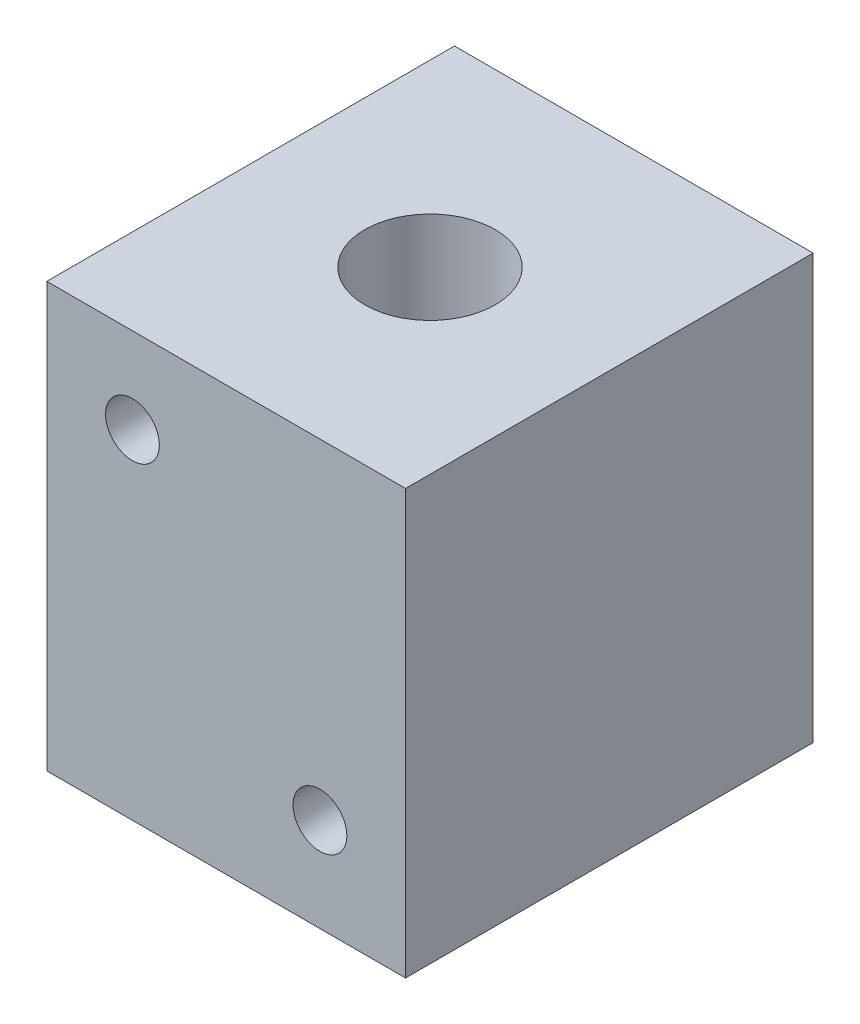
ISO-10303-21;
HEADER;
FILE_DESCRIPTION(('STEP AP214'),'2;1');
FILE_NAME('part.step','',(''),(''),'','','');
FILE_SCHEMA(('AUTOMOTIVE_DESIGN { 1 0 10303 214 1 1 1 1 }'));
ENDSEC;
DATA;
#1=APPLICATION_CONTEXT('core data for automotive mechanical design processes');
#2=APPLICATION_PROTOCOL_DEFINITION('international standard','automotive_design',2000,#1);
#3=PRODUCT_CONTEXT('',#1,'mechanical');
#4=PRODUCT('Part','Part','',(#3));
#5=PRODUCT_RELATED_PRODUCT_CATEGORY('part','',(#4));
#6=PRODUCT_DEFINITION_FORMATION('','',#4);
#7=PRODUCT_DEFINITION_CONTEXT('part definition',#1,'design');
#8=PRODUCT_DEFINITION('design','',#6,#7);
#9=PRODUCT_DEFINITION_SHAPE('','',#8);
#10=(LENGTH_UNIT() NAMED_UNIT(*) SI_UNIT(.MILLI.,.METRE.));
#11=(NAMED_UNIT(*) PLANE_ANGLE_UNIT() SI_UNIT($,.RADIAN.));
#12=(NAMED_UNIT(*) SI_UNIT($,.STERADIAN.) SOLID_ANGLE_UNIT());
#13=UNCERTAINTY_MEASURE_WITH_UNIT(LENGTH_MEASURE(1.E-05),#10,'distance_accuracy_value','');
#14=(GEOMETRIC_REPRESENTATION_CONTEXT(3) GLOBAL_UNCERTAINTY_ASSIGNED_CONTEXT((#13)) GLOBAL_UNIT_ASSIGNED_CONTEXT((#10,
#11,#12)) REPRESENTATION_CONTEXT('',''));
#15=CARTESIAN_POINT('',(0.,0.,0.));
#16=DIRECTION('',(0.,0.,1.));
#17=DIRECTION('',(1.,0.,0.));
#18=AXIS2_PLACEMENT_3D('',#15,#16,#17);
#19=CARTESIAN_POINT('',(11.,26.,12.5));
#20=DIRECTION('',(-1.,0.,0.));
#21=DIRECTION('',(0.,0.,1.));
#22=AXIS2_PLACEMENT_3D('',#19,#20,#21);
#23=PLANE('',#22);
#24=DIRECTION('',(0.,0.,-1.));
#25=VECTOR('',#24,1.);
#26=CARTESIAN_POINT('',(11.,0.,12.5));
#27=LINE('',#26,#25);
#28=CARTESIAN_POINT('',(11.,0.,12.5));
#29=VERTEX_POINT('',#28);
#30=CARTESIAN_POINT('',(11.,0.,-12.5));
#31=VERTEX_POINT('',#30);
#32=EDGE_CURVE('E112',#29,#31,#27,.T.);
#33=ORIENTED_EDGE('',*,*,#32,.T.);
#34=DIRECTION('',(0.,-1.,0.));
#35=VECTOR('',#34,1.);
#36=CARTESIAN_POINT('',(11.,26.,-12.5));
#37=LINE('',#36,#35);
#38=CARTESIAN_POINT('',(11.,26.,-12.5));
#39=VERTEX_POINT('',#38);
#40=EDGE_CURVE('E11',#39,#31,#37,.T.);
#41=ORIENTED_EDGE('',*,*,#40,.F.);
#42=DIRECTION('',(0.,0.,-1.));
#43=VECTOR('',#42,1.);
#44=CARTESIAN_POINT('',(11.,26.,12.5));
#45=LINE('',#44,#43);
#46=CARTESIAN_POINT('',(11.,26.,12.5));
#47=VERTEX_POINT('',#46);
#48=EDGE_CURVE('E96',#47,#39,#45,.T.);
#49=ORIENTED_EDGE('',*,*,#48,.F.);
#50=DIRECTION('',(0.,-1.,0.));
#51=VECTOR('',#50,1.);
#52=CARTESIAN_POINT('',(11.,26.,12.5));
#53=LINE('',#52,#51);
#54=EDGE_CURVE('E108',#47,#29,#53,.T.);
#55=ORIENTED_EDGE('',*,*,#54,.T.);
#56=EDGE_LOOP('',(#33,#41,#49,#55));
#57=FACE_BOUND('',#56,.T.);
#58=ADVANCED_FACE('F44',(#57),#23,.F.);
#59=CARTESIAN_POINT('',(-11.,26.,-12.5));
#60=DIRECTION('',(0.,0.,1.));
#61=DIRECTION('',(1.,0.,0.));
#62=AXIS2_PLACEMENT_3D('',#59,#60,#61);
#63=PLANE('',#62);
#64=DIRECTION('',(-1.,0.,0.));
#65=VECTOR('',#64,1.);
#66=CARTESIAN_POINT('',(-11.,0.,-12.5));
#67=LINE('',#66,#65);
#68=CARTESIAN_POINT('',(-11.,0.,-12.5));
#69=VERTEX_POINT('',#68);
#70=EDGE_CURVE('E101',#31,#69,#67,.T.);
#71=ORIENTED_EDGE('',*,*,#70,.T.);
#72=DIRECTION('',(0.,-1.,0.));
#73=VECTOR('',#72,1.);
#74=CARTESIAN_POINT('',(-11.,26.,-12.5));
#75=LINE('',#74,#73);
#76=CARTESIAN_POINT('',(-11.,26.,-12.5));
#77=VERTEX_POINT('',#76);
#78=EDGE_CURVE('E53',#77,#69,#75,.T.);
#79=ORIENTED_EDGE('',*,*,#78,.F.);
#80=DIRECTION('',(-1.,0.,0.));
#81=VECTOR('',#80,1.);
#82=CARTESIAN_POINT('',(-11.,26.,-12.5));
#83=LINE('',#82,#81);
#84=EDGE_CURVE('E91',#39,#77,#83,.T.);
#85=ORIENTED_EDGE('',*,*,#84,.F.);
#86=ORIENTED_EDGE('',*,*,#40,.T.);
#87=EDGE_LOOP('',(#71,#79,#85,#86));
#88=FACE_BOUND('',#87,.T.);
#89=ADVANCED_FACE('F100',(#88),#63,.F.);
#90=CARTESIAN_POINT('',(-11.,26.,12.5));
#91=DIRECTION('',(1.,0.,0.));
#92=DIRECTION('',(0.,0.,-1.));
#93=AXIS2_PLACEMENT_3D('',#90,#91,#92);
#94=PLANE('',#93);
#95=DIRECTION('',(0.,0.,1.));
#96=VECTOR('',#95,1.);
#97=CARTESIAN_POINT('',(-11.,0.,12.5));
#98=LINE('',#97,#96);
#99=CARTESIAN_POINT('',(-11.,0.,12.5));
#100=VERTEX_POINT('',#99);
#101=EDGE_CURVE('E78',#69,#100,#98,.T.);
#102=ORIENTED_EDGE('',*,*,#101,.T.);
#103=DIRECTION('',(0.,-1.,0.));
#104=VECTOR('',#103,1.);
#105=CARTESIAN_POINT('',(-11.,26.,12.5));
#106=LINE('',#105,#104);
#107=CARTESIAN_POINT('',(-11.,26.,12.5));
#108=VERTEX_POINT('',#107);
#109=EDGE_CURVE('E103',#108,#100,#106,.T.);
#110=ORIENTED_EDGE('',*,*,#109,.F.);
#111=DIRECTION('',(0.,0.,1.));
#112=VECTOR('',#111,1.);
#113=CARTESIAN_POINT('',(-11.,26.,12.5));
#114=LINE('',#113,#112);
#115=EDGE_CURVE('E94',#77,#108,#114,.T.);
#116=ORIENTED_EDGE('',*,*,#115,.F.);
#117=ORIENTED_EDGE('',*,*,#78,.T.);
#118=EDGE_LOOP('',(#102,#110,#116,#117));
#119=FACE_BOUND('',#118,.T.);
#120=ADVANCED_FACE('F104',(#119),#94,.F.);
#121=CARTESIAN_POINT('',(-11.,26.,12.5));
#122=DIRECTION('',(0.,0.,-1.));
#123=DIRECTION('',(-1.,0.,0.));
#124=AXIS2_PLACEMENT_3D('',#121,#122,#123);
#125=PLANE('',#124);
#126=CARTESIAN_POINT('',(-5.75,20.75,12.5));
#127=DIRECTION('',(0.,0.,1.));
#128=DIRECTION('',(1.,0.,0.));
#129=AXIS2_PLACEMENT_3D('',#126,#127,#128);
#130=CIRCLE('',#129,1.65);
#131=CARTESIAN_POINT('',(-4.1,20.75,12.5));
#132=VERTEX_POINT('',#131);
#133=EDGE_CURVE('E149',#132,#132,#130,.T.);
#134=ORIENTED_EDGE('',*,*,#133,.F.);
#135=EDGE_LOOP('',(#134));
#136=FACE_BOUND('',#135,.T.);
#137=CARTESIAN_POINT('',(5.74999999999999,5.75,12.5));
#138=DIRECTION('',(0.,0.,1.));
#139=DIRECTION('',(1.,0.,0.));
#140=AXIS2_PLACEMENT_3D('',#137,#138,#139);
#141=CIRCLE('',#140,1.65);
#142=CARTESIAN_POINT('',(7.39999999999999,5.75,12.5));
#143=VERTEX_POINT('',#142);
#144=EDGE_CURVE('E145',#143,#143,#141,.T.);
#145=ORIENTED_EDGE('',*,*,#144,.F.);
#146=EDGE_LOOP('',(#145));
#147=FACE_BOUND('',#146,.T.);
#148=DIRECTION('',(1.,0.,0.));
#149=VECTOR('',#148,1.);
#150=CARTESIAN_POINT('',(-11.,0.,12.5));
#151=LINE('',#150,#149);
#152=EDGE_CURVE('E84',#100,#29,#151,.T.);
#153=ORIENTED_EDGE('',*,*,#152,.T.);
#154=ORIENTED_EDGE('',*,*,#54,.F.);
#155=DIRECTION('',(1.,0.,0.));
#156=VECTOR('',#155,1.);
#157=CARTESIAN_POINT('',(-11.,26.,12.5));
#158=LINE('',#157,#156);
#159=EDGE_CURVE('E61',#108,#47,#158,.T.);
#160=ORIENTED_EDGE('',*,*,#159,.F.);
#161=ORIENTED_EDGE('',*,*,#109,.T.);
#162=EDGE_LOOP('',(#153,#154,#160,#161));
#163=FACE_BOUND('',#162,.T.);
#164=ADVANCED_FACE('F126',(#136,#147,#163),#125,.F.);
#165=CARTESIAN_POINT('',(0.,26.,0.));
#166=DIRECTION('',(0.,-1.,0.));
#167=DIRECTION('',(0.,0.,-1.));
#168=AXIS2_PLACEMENT_3D('',#165,#166,#167);
#169=PLANE('',#168);
#170=CARTESIAN_POINT('',(0.,26.,0.));
#171=DIRECTION('',(0.,1.,0.));
#172=DIRECTION('',(0.,0.,1.));
#173=AXIS2_PLACEMENT_3D('',#170,#171,#172);
#174=CIRCLE('',#173,4.);
#175=CARTESIAN_POINT('',(0.,26.,4.));
#176=VERTEX_POINT('',#175);
#177=EDGE_CURVE('E133',#176,#176,#174,.T.);
#178=ORIENTED_EDGE('',*,*,#177,.F.);
#179=EDGE_LOOP('',(#178));
#180=FACE_BOUND('',#179,.T.);
#181=ORIENTED_EDGE('',*,*,#48,.T.);
#182=ORIENTED_EDGE('',*,*,#84,.T.);
#183=ORIENTED_EDGE('',*,*,#115,.T.);
#184=ORIENTED_EDGE('',*,*,#159,.T.);
#185=EDGE_LOOP('',(#181,#182,#183,#184));
#186=FACE_BOUND('',#185,.T.);
#187=ADVANCED_FACE('F92',(#180,#186),#169,.F.);
#188=CARTESIAN_POINT('',(0.,0.,0.));
#189=DIRECTION('',(0.,-1.,0.));
#190=DIRECTION('',(0.,0.,-1.));
#191=AXIS2_PLACEMENT_3D('',#188,#189,#190);
#192=PLANE('',#191);
#193=ORIENTED_EDGE('',*,*,#32,.F.);
#194=ORIENTED_EDGE('',*,*,#152,.F.);
#195=ORIENTED_EDGE('',*,*,#101,.F.);
#196=ORIENTED_EDGE('',*,*,#70,.F.);
#197=EDGE_LOOP('',(#193,#194,#195,#196));
#198=FACE_BOUND('',#197,.T.);
#199=ADVANCED_FACE('F129',(#198),#192,.T.);
#200=CARTESIAN_POINT('',(0.,9.,0.));
#201=DIRECTION('',(0.,1.,0.));
#202=DIRECTION('',(0.,0.,1.));
#203=AXIS2_PLACEMENT_3D('',#200,#201,#202);
#204=CYLINDRICAL_SURFACE('',#203,4.);
#205=CARTESIAN_POINT('',(0.,9.,0.));
#206=DIRECTION('',(0.,1.,0.));
#207=DIRECTION('',(0.,0.,1.));
#208=AXIS2_PLACEMENT_3D('',#205,#206,#207);
#209=CIRCLE('',#208,4.);
#210=CARTESIAN_POINT('',(0.,9.,4.));
#211=VERTEX_POINT('',#210);
#212=EDGE_CURVE('E116',#211,#211,#209,.T.);
#213=ORIENTED_EDGE('',*,*,#212,.F.);
#214=EDGE_LOOP('',(#213));
#215=FACE_BOUND('',#214,.T.);
#216=ORIENTED_EDGE('',*,*,#177,.T.);
#217=EDGE_LOOP('',(#216));
#218=FACE_BOUND('',#217,.T.);
#219=ADVANCED_FACE('F182',(#215,#218),#204,.F.);
#220=CARTESIAN_POINT('',(0.,9.,0.));
#221=DIRECTION('',(0.,1.,0.));
#222=DIRECTION('',(0.,0.,1.));
#223=AXIS2_PLACEMENT_3D('',#220,#221,#222);
#224=PLANE('',#223);
#225=ORIENTED_EDGE('',*,*,#212,.T.);
#226=EDGE_LOOP('',(#225));
#227=FACE_BOUND('',#226,.T.);
#228=ADVANCED_FACE('F173',(#227),#224,.T.);
#229=CARTESIAN_POINT('',(5.74999999999999,5.75,2.5));
#230=DIRECTION('',(0.,0.,1.));
#231=DIRECTION('',(1.,0.,0.));
#232=AXIS2_PLACEMENT_3D('',#229,#230,#231);
#233=CYLINDRICAL_SURFACE('',#232,1.65);
#234=CARTESIAN_POINT('',(5.74999999999999,5.75,2.5));
#235=DIRECTION('',(0.,0.,1.));
#236=DIRECTION('',(1.,0.,0.));
#237=AXIS2_PLACEMENT_3D('',#234,#235,#236);
#238=CIRCLE('',#237,1.65);
#239=CARTESIAN_POINT('',(7.39999999999999,5.75,2.5));
#240=VERTEX_POINT('',#239);
#241=EDGE_CURVE('E141',#240,#240,#238,.T.);
#242=ORIENTED_EDGE('',*,*,#241,.F.);
#243=EDGE_LOOP('',(#242));
#244=FACE_BOUND('',#243,.T.);
#245=ORIENTED_EDGE('',*,*,#144,.T.);
#246=EDGE_LOOP('',(#245));
#247=FACE_BOUND('',#246,.T.);
#248=ADVANCED_FACE('F171',(#244,#247),#233,.F.);
#249=CARTESIAN_POINT('',(5.74999999999999,5.75,2.5));
#250=DIRECTION('',(0.,0.,1.));
#251=DIRECTION('',(1.,0.,0.));
#252=AXIS2_PLACEMENT_3D('',#249,#250,#251);
#253=PLANE('',#252);
#254=ORIENTED_EDGE('',*,*,#241,.T.);
#255=EDGE_LOOP('',(#254));
#256=FACE_BOUND('',#255,.T.);
#257=ADVANCED_FACE('F162',(#256),#253,.T.);
#258=CARTESIAN_POINT('',(-5.75,20.75,2.5));
#259=DIRECTION('',(0.,0.,1.));
#260=DIRECTION('',(1.,0.,0.));
#261=AXIS2_PLACEMENT_3D('',#258,#259,#260);
#262=CYLINDRICAL_SURFACE('',#261,1.65);
#263=CARTESIAN_POINT('',(-5.75,20.75,2.5));
#264=DIRECTION('',(0.,0.,1.));
#265=DIRECTION('',(1.,0.,0.));
#266=AXIS2_PLACEMENT_3D('',#263,#264,#265);
#267=CIRCLE('',#266,1.65);
#268=CARTESIAN_POINT('',(-4.1,20.75,2.5));
#269=VERTEX_POINT('',#268);
#270=EDGE_CURVE('E137',#269,#269,#267,.T.);
#271=ORIENTED_EDGE('',*,*,#270,.F.);
#272=EDGE_LOOP('',(#271));
#273=FACE_BOUND('',#272,.T.);
#274=ORIENTED_EDGE('',*,*,#133,.T.);
#275=EDGE_LOOP('',(#274));
#276=FACE_BOUND('',#275,.T.);
#277=ADVANCED_FACE('F159',(#273,#276),#262,.F.);
#278=CARTESIAN_POINT('',(-5.75,20.75,2.5));
#279=DIRECTION('',(0.,0.,1.));
#280=DIRECTION('',(1.,0.,0.));
#281=AXIS2_PLACEMENT_3D('',#278,#279,#280);
#282=PLANE('',#281);
#283=ORIENTED_EDGE('',*,*,#270,.T.);
#284=EDGE_LOOP('',(#283));
#285=FACE_BOUND('',#284,.T.);
#286=ADVANCED_FACE('F157',(#285),#282,.T.);
#287=CLOSED_SHELL('',(#58,#89,#120,#164,#187,#199,#219,#228,#248,#257,#277,#286));
#288=MANIFOLD_SOLID_BREP('B2',#287);
#289=ADVANCED_BREP_SHAPE_REPRESENTATION('',(#18,#288),#14);
#290=SHAPE_DEFINITION_REPRESENTATION(#9,#289);
ENDSEC;
END-ISO-10303-21;
